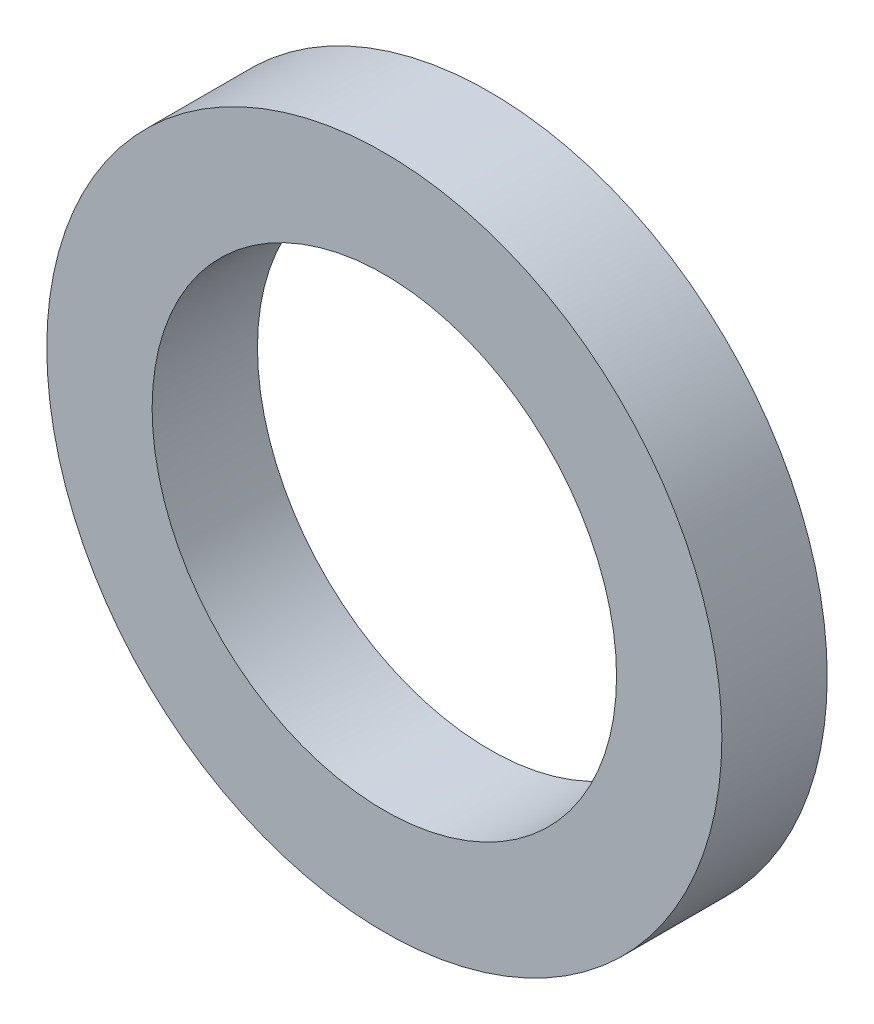
ISO-10303-21;
HEADER;
FILE_DESCRIPTION(('STEP AP214'),'2;1');
FILE_NAME('part.step','',(''),(''),'','','');
FILE_SCHEMA(('AUTOMOTIVE_DESIGN { 1 0 10303 214 1 1 1 1 }'));
ENDSEC;
DATA;
#1=APPLICATION_CONTEXT('core data for automotive mechanical design processes');
#2=APPLICATION_PROTOCOL_DEFINITION('international standard','automotive_design',2000,#1);
#3=PRODUCT_CONTEXT('',#1,'mechanical');
#4=PRODUCT('Part','Part','',(#3));
#5=PRODUCT_RELATED_PRODUCT_CATEGORY('part','',(#4));
#6=PRODUCT_DEFINITION_FORMATION('','',#4);
#7=PRODUCT_DEFINITION_CONTEXT('part definition',#1,'design');
#8=PRODUCT_DEFINITION('design','',#6,#7);
#9=PRODUCT_DEFINITION_SHAPE('','',#8);
#10=(LENGTH_UNIT() NAMED_UNIT(*) SI_UNIT(.MILLI.,.METRE.));
#11=(NAMED_UNIT(*) PLANE_ANGLE_UNIT() SI_UNIT($,.RADIAN.));
#12=(NAMED_UNIT(*) SI_UNIT($,.STERADIAN.) SOLID_ANGLE_UNIT());
#13=UNCERTAINTY_MEASURE_WITH_UNIT(LENGTH_MEASURE(1.E-05),#10,'distance_accuracy_value','');
#14=(GEOMETRIC_REPRESENTATION_CONTEXT(3) GLOBAL_UNCERTAINTY_ASSIGNED_CONTEXT((#13)) GLOBAL_UNIT_ASSIGNED_CONTEXT((#10,
#11,#12)) REPRESENTATION_CONTEXT('',''));
#15=CARTESIAN_POINT('',(0.,0.,0.));
#16=DIRECTION('',(0.,0.,1.));
#17=DIRECTION('',(1.,0.,0.));
#18=AXIS2_PLACEMENT_3D('',#15,#16,#17);
#19=CARTESIAN_POINT('',(25.493,16.8,38.3042459942925));
#20=DIRECTION('',(0.,0.,-1.));
#21=DIRECTION('',(-1.,0.,0.));
#22=AXIS2_PLACEMENT_3D('',#19,#20,#21);
#23=CYLINDRICAL_SURFACE('',#22,10.175);
#24=CARTESIAN_POINT('',(25.493,16.8,6.35));
#25=DIRECTION('',(0.,0.,1.));
#26=DIRECTION('',(1.,0.,0.));
#27=AXIS2_PLACEMENT_3D('',#24,#25,#26);
#28=CIRCLE('',#27,10.175);
#29=CARTESIAN_POINT('',(35.668,16.8,6.35));
#30=VERTEX_POINT('',#29);
#31=EDGE_CURVE('E49',#30,#30,#28,.T.);
#32=ORIENTED_EDGE('',*,*,#31,.T.);
#33=EDGE_LOOP('',(#32));
#34=FACE_BOUND('',#33,.T.);
#35=CARTESIAN_POINT('',(25.493,16.8,9.525));
#36=DIRECTION('',(0.,0.,1.));
#37=DIRECTION('',(1.,0.,0.));
#38=AXIS2_PLACEMENT_3D('',#35,#36,#37);
#39=CIRCLE('',#38,10.175);
#40=CARTESIAN_POINT('',(35.668,16.8,9.525));
#41=VERTEX_POINT('',#40);
#42=EDGE_CURVE('E10',#41,#41,#39,.T.);
#43=ORIENTED_EDGE('',*,*,#42,.F.);
#44=EDGE_LOOP('',(#43));
#45=FACE_BOUND('',#44,.T.);
#46=ADVANCED_FACE('F42',(#34,#45),#23,.T.);
#47=CARTESIAN_POINT('',(25.493,16.8,6.35));
#48=DIRECTION('',(0.,0.,1.));
#49=DIRECTION('',(1.,0.,0.));
#50=AXIS2_PLACEMENT_3D('',#47,#48,#49);
#51=PLANE('',#50);
#52=ORIENTED_EDGE('',*,*,#31,.F.);
#53=EDGE_LOOP('',(#52));
#54=FACE_BOUND('',#53,.T.);
#55=CARTESIAN_POINT('',(25.493,16.8,6.35));
#56=DIRECTION('',(0.,0.,1.));
#57=DIRECTION('',(1.,0.,0.));
#58=AXIS2_PLACEMENT_3D('',#55,#56,#57);
#59=CIRCLE('',#58,7.);
#60=CARTESIAN_POINT('',(32.493,16.8,6.35));
#61=VERTEX_POINT('',#60);
#62=EDGE_CURVE('E54',#61,#61,#59,.T.);
#63=ORIENTED_EDGE('',*,*,#62,.T.);
#64=EDGE_LOOP('',(#63));
#65=FACE_BOUND('',#64,.T.);
#66=ADVANCED_FACE('F70',(#54,#65),#51,.F.);
#67=CARTESIAN_POINT('',(25.493,16.8,38.3042459942925));
#68=DIRECTION('',(0.,0.,-1.));
#69=DIRECTION('',(-1.,0.,0.));
#70=AXIS2_PLACEMENT_3D('',#67,#68,#69);
#71=CYLINDRICAL_SURFACE('',#70,7.);
#72=ORIENTED_EDGE('',*,*,#62,.F.);
#73=EDGE_LOOP('',(#72));
#74=FACE_BOUND('',#73,.T.);
#75=CARTESIAN_POINT('',(25.493,16.8,9.525));
#76=DIRECTION('',(0.,0.,1.));
#77=DIRECTION('',(1.,0.,0.));
#78=AXIS2_PLACEMENT_3D('',#75,#76,#77);
#79=CIRCLE('',#78,7.);
#80=CARTESIAN_POINT('',(32.493,16.8,9.525));
#81=VERTEX_POINT('',#80);
#82=EDGE_CURVE('E45',#81,#81,#79,.T.);
#83=ORIENTED_EDGE('',*,*,#82,.T.);
#84=EDGE_LOOP('',(#83));
#85=FACE_BOUND('',#84,.T.);
#86=ADVANCED_FACE('F62',(#74,#85),#71,.F.);
#87=CARTESIAN_POINT('',(0.,0.,9.525));
#88=DIRECTION('',(0.,0.,1.));
#89=DIRECTION('',(1.,0.,0.));
#90=AXIS2_PLACEMENT_3D('',#87,#88,#89);
#91=PLANE('',#90);
#92=ORIENTED_EDGE('',*,*,#82,.F.);
#93=EDGE_LOOP('',(#92));
#94=FACE_BOUND('',#93,.T.);
#95=ORIENTED_EDGE('',*,*,#42,.T.);
#96=EDGE_LOOP('',(#95));
#97=FACE_BOUND('',#96,.T.);
#98=ADVANCED_FACE('F64',(#94,#97),#91,.T.);
#99=CLOSED_SHELL('',(#46,#66,#86,#98));
#100=MANIFOLD_SOLID_BREP('B2',#99);
#101=ADVANCED_BREP_SHAPE_REPRESENTATION('',(#18,#100),#14);
#102=SHAPE_DEFINITION_REPRESENTATION(#9,#101);
ENDSEC;
END-ISO-10303-21;
